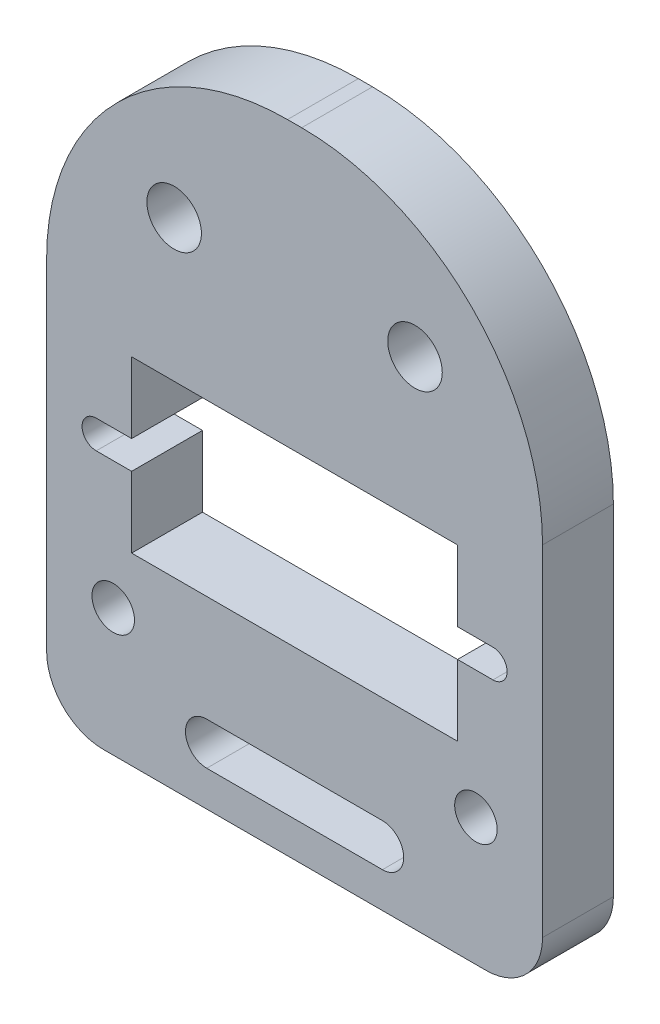
ISO-10303-21;
HEADER;
FILE_DESCRIPTION(('STEP AP214'),'2;1');
FILE_NAME('part.step','',(''),(''),'','','');
FILE_SCHEMA(('AUTOMOTIVE_DESIGN { 1 0 10303 214 1 1 1 1 }'));
ENDSEC;
DATA;
#1=APPLICATION_CONTEXT('core data for automotive mechanical design processes');
#2=APPLICATION_PROTOCOL_DEFINITION('international standard','automotive_design',2000,#1);
#3=PRODUCT_CONTEXT('',#1,'mechanical');
#4=PRODUCT('Part','Part','',(#3));
#5=PRODUCT_RELATED_PRODUCT_CATEGORY('part','',(#4));
#6=PRODUCT_DEFINITION_FORMATION('','',#4);
#7=PRODUCT_DEFINITION_CONTEXT('part definition',#1,'design');
#8=PRODUCT_DEFINITION('design','',#6,#7);
#9=PRODUCT_DEFINITION_SHAPE('','',#8);
#10=(LENGTH_UNIT() NAMED_UNIT(*) SI_UNIT(.MILLI.,.METRE.));
#11=(NAMED_UNIT(*) PLANE_ANGLE_UNIT() SI_UNIT($,.RADIAN.));
#12=(NAMED_UNIT(*) SI_UNIT($,.STERADIAN.) SOLID_ANGLE_UNIT());
#13=UNCERTAINTY_MEASURE_WITH_UNIT(LENGTH_MEASURE(1.E-05),#10,'distance_accuracy_value','');
#14=(GEOMETRIC_REPRESENTATION_CONTEXT(3) GLOBAL_UNCERTAINTY_ASSIGNED_CONTEXT((#13)) GLOBAL_UNIT_ASSIGNED_CONTEXT((#10,
#11,#12)) REPRESENTATION_CONTEXT('',''));
#15=CARTESIAN_POINT('',(0.,0.,0.));
#16=DIRECTION('',(0.,0.,1.));
#17=DIRECTION('',(1.,0.,0.));
#18=AXIS2_PLACEMENT_3D('',#15,#16,#17);
#19=CARTESIAN_POINT('',(-0.5,5.49999999999995,5.));
#20=DIRECTION('',(0.,0.,1.));
#21=DIRECTION('',(1.,0.,0.));
#22=AXIS2_PLACEMENT_3D('',#19,#20,#21);
#23=PLANE('',#22);
#24=CARTESIAN_POINT('',(-12.7999999999999,-13.5000000000001,5.));
#25=DIRECTION('',(0.,0.,1.));
#26=DIRECTION('',(1.,0.,0.));
#27=AXIS2_PLACEMENT_3D('',#24,#25,#26);
#28=CIRCLE('',#27,1.5);
#29=CARTESIAN_POINT('',(-11.2999999999999,-13.5000000000001,5.));
#30=VERTEX_POINT('',#29);
#31=EDGE_CURVE('E292',#30,#30,#28,.T.);
#32=ORIENTED_EDGE('',*,*,#31,.F.);
#33=EDGE_LOOP('',(#32));
#34=FACE_BOUND('',#33,.T.);
#35=CARTESIAN_POINT('',(8.5,12.5,5.));
#36=DIRECTION('',(0.,0.,1.));
#37=DIRECTION('',(1.,0.,0.));
#38=AXIS2_PLACEMENT_3D('',#35,#36,#37);
#39=CIRCLE('',#38,1.92500000000001);
#40=CARTESIAN_POINT('',(10.425,12.5,5.));
#41=VERTEX_POINT('',#40);
#42=EDGE_CURVE('E304',#41,#41,#39,.T.);
#43=ORIENTED_EDGE('',*,*,#42,.F.);
#44=EDGE_LOOP('',(#43));
#45=FACE_BOUND('',#44,.T.);
#46=CARTESIAN_POINT('',(-0.5,5.49999999999995,5.));
#47=DIRECTION('',(0.,0.,1.));
#48=DIRECTION('',(1.,0.,0.));
#49=AXIS2_PLACEMENT_3D('',#46,#47,#48);
#50=CIRCLE('',#49,17.);
#51=CARTESIAN_POINT('',(-0.5,22.5,5.));
#52=VERTEX_POINT('',#51);
#53=CARTESIAN_POINT('',(-17.5,5.49999999999995,5.));
#54=VERTEX_POINT('',#53);
#55=EDGE_CURVE('E340',#52,#54,#50,.T.);
#56=ORIENTED_EDGE('',*,*,#55,.T.);
#57=DIRECTION('',(0.,-1.,0.));
#58=VECTOR('',#57,1.);
#59=CARTESIAN_POINT('',(-17.5,-18.5000000000001,5.));
#60=LINE('',#59,#58);
#61=CARTESIAN_POINT('',(-17.5,-18.5000000000001,5.));
#62=VERTEX_POINT('',#61);
#63=EDGE_CURVE('E343',#54,#62,#60,.T.);
#64=ORIENTED_EDGE('',*,*,#63,.T.);
#65=CARTESIAN_POINT('',(-13.5,-18.5000000000001,5.));
#66=DIRECTION('',(0.,0.,1.));
#67=DIRECTION('',(1.,0.,0.));
#68=AXIS2_PLACEMENT_3D('',#65,#66,#67);
#69=CIRCLE('',#68,4.);
#70=CARTESIAN_POINT('',(-13.5,-22.5000000000001,5.));
#71=VERTEX_POINT('',#70);
#72=EDGE_CURVE('E346',#62,#71,#69,.T.);
#73=ORIENTED_EDGE('',*,*,#72,.T.);
#74=DIRECTION('',(1.,0.,0.));
#75=VECTOR('',#74,1.);
#76=CARTESIAN_POINT('',(13.5,-22.5000000000001,5.));
#77=LINE('',#76,#75);
#78=CARTESIAN_POINT('',(13.5,-22.5000000000001,5.));
#79=VERTEX_POINT('',#78);
#80=EDGE_CURVE('E348',#71,#79,#77,.T.);
#81=ORIENTED_EDGE('',*,*,#80,.T.);
#82=CARTESIAN_POINT('',(13.5,-18.5000000000001,5.));
#83=DIRECTION('',(0.,0.,1.));
#84=DIRECTION('',(1.,0.,0.));
#85=AXIS2_PLACEMENT_3D('',#82,#83,#84);
#86=CIRCLE('',#85,4.00000000000004);
#87=CARTESIAN_POINT('',(17.5000000000001,-18.5000000000001,5.));
#88=VERTEX_POINT('',#87);
#89=EDGE_CURVE('E350',#79,#88,#86,.T.);
#90=ORIENTED_EDGE('',*,*,#89,.T.);
#91=DIRECTION('',(0.,1.,0.));
#92=VECTOR('',#91,1.);
#93=CARTESIAN_POINT('',(17.5,5.5,5.));
#94=LINE('',#93,#92);
#95=CARTESIAN_POINT('',(17.5,5.5,5.));
#96=VERTEX_POINT('',#95);
#97=EDGE_CURVE('E352',#88,#96,#94,.T.);
#98=ORIENTED_EDGE('',*,*,#97,.T.);
#99=CARTESIAN_POINT('',(0.5,5.49999999999995,5.));
#100=DIRECTION('',(0.,0.,1.));
#101=DIRECTION('',(1.,0.,0.));
#102=AXIS2_PLACEMENT_3D('',#99,#100,#101);
#103=CIRCLE('',#102,17.);
#104=CARTESIAN_POINT('',(0.5,22.5,5.));
#105=VERTEX_POINT('',#104);
#106=EDGE_CURVE('E354',#96,#105,#103,.T.);
#107=ORIENTED_EDGE('',*,*,#106,.T.);
#108=DIRECTION('',(-1.,0.,0.));
#109=VECTOR('',#108,1.);
#110=CARTESIAN_POINT('',(-0.5,22.5,5.));
#111=LINE('',#110,#109);
#112=EDGE_CURVE('E356',#105,#52,#111,.T.);
#113=ORIENTED_EDGE('',*,*,#112,.T.);
#114=EDGE_LOOP('',(#56,#64,#73,#81,#90,#98,#107,#113));
#115=FACE_BOUND('',#114,.T.);
#116=DIRECTION('',(1.,0.,0.));
#117=VECTOR('',#116,1.);
#118=CARTESIAN_POINT('',(-6.2,-20.0000000000001,5.));
#119=LINE('',#118,#117);
#120=CARTESIAN_POINT('',(-6.2,-20.0000000000001,5.));
#121=VERTEX_POINT('',#120);
#122=CARTESIAN_POINT('',(6.2,-20.0000000000001,5.));
#123=VERTEX_POINT('',#122);
#124=EDGE_CURVE('E312',#121,#123,#119,.T.);
#125=ORIENTED_EDGE('',*,*,#124,.F.);
#126=CARTESIAN_POINT('',(-6.2,-18.5000000000001,5.));
#127=DIRECTION('',(0.,0.,1.));
#128=DIRECTION('',(1.,0.,0.));
#129=AXIS2_PLACEMENT_3D('',#126,#127,#128);
#130=CIRCLE('',#129,1.5);
#131=CARTESIAN_POINT('',(-6.2,-17.0000000000001,5.));
#132=VERTEX_POINT('',#131);
#133=EDGE_CURVE('E310',#132,#121,#130,.T.);
#134=ORIENTED_EDGE('',*,*,#133,.F.);
#135=DIRECTION('',(-1.,0.,0.));
#136=VECTOR('',#135,1.);
#137=CARTESIAN_POINT('',(6.2,-17.0000000000001,5.));
#138=LINE('',#137,#136);
#139=CARTESIAN_POINT('',(6.2,-17.0000000000001,5.));
#140=VERTEX_POINT('',#139);
#141=EDGE_CURVE('E318',#140,#132,#138,.T.);
#142=ORIENTED_EDGE('',*,*,#141,.F.);
#143=CARTESIAN_POINT('',(6.2,-18.5000000000001,5.));
#144=DIRECTION('',(0.,0.,1.));
#145=DIRECTION('',(1.,0.,0.));
#146=AXIS2_PLACEMENT_3D('',#143,#144,#145);
#147=CIRCLE('',#146,1.5);
#148=EDGE_CURVE('E315',#123,#140,#147,.T.);
#149=ORIENTED_EDGE('',*,*,#148,.F.);
#150=EDGE_LOOP('',(#125,#134,#142,#149));
#151=FACE_BOUND('',#150,.T.);
#152=CARTESIAN_POINT('',(-8.5,12.5,5.));
#153=DIRECTION('',(0.,0.,1.));
#154=DIRECTION('',(1.,0.,0.));
#155=AXIS2_PLACEMENT_3D('',#152,#153,#154);
#156=CIRCLE('',#155,1.92500000000001);
#157=CARTESIAN_POINT('',(-6.57499999999999,12.5,5.));
#158=VERTEX_POINT('',#157);
#159=EDGE_CURVE('E298',#158,#158,#156,.T.);
#160=ORIENTED_EDGE('',*,*,#159,.F.);
#161=EDGE_LOOP('',(#160));
#162=FACE_BOUND('',#161,.T.);
#163=CARTESIAN_POINT('',(12.8,-13.5000000000001,5.));
#164=DIRECTION('',(0.,0.,1.));
#165=DIRECTION('',(1.,0.,0.));
#166=AXIS2_PLACEMENT_3D('',#163,#164,#165);
#167=CIRCLE('',#166,1.5);
#168=CARTESIAN_POINT('',(14.3,-13.5000000000001,5.));
#169=VERTEX_POINT('',#168);
#170=EDGE_CURVE('E286',#169,#169,#167,.T.);
#171=ORIENTED_EDGE('',*,*,#170,.F.);
#172=EDGE_LOOP('',(#171));
#173=FACE_BOUND('',#172,.T.);
#174=DIRECTION('',(-1.,0.,0.));
#175=VECTOR('',#174,1.);
#176=CARTESIAN_POINT('',(14.,-2.49999999999916,5.));
#177=LINE('',#176,#175);
#178=CARTESIAN_POINT('',(14.,-2.49999999999916,5.));
#179=VERTEX_POINT('',#178);
#180=CARTESIAN_POINT('',(11.5,-2.49999999999917,5.));
#181=VERTEX_POINT('',#180);
#182=EDGE_CURVE('E201',#179,#181,#177,.T.);
#183=ORIENTED_EDGE('',*,*,#182,.F.);
#184=CARTESIAN_POINT('',(14.,-3.49999999999917,5.));
#185=DIRECTION('',(0.,0.,1.));
#186=DIRECTION('',(1.,0.,0.));
#187=AXIS2_PLACEMENT_3D('',#184,#185,#186);
#188=CIRCLE('',#187,1.);
#189=CARTESIAN_POINT('',(14.0000000000002,-4.49999999999917,5.));
#190=VERTEX_POINT('',#189);
#191=EDGE_CURVE('E193',#190,#179,#188,.T.);
#192=ORIENTED_EDGE('',*,*,#191,.F.);
#193=DIRECTION('',(1.,0.,0.));
#194=VECTOR('',#193,1.);
#195=CARTESIAN_POINT('',(11.5,-4.49999999999917,5.));
#196=LINE('',#195,#194);
#197=CARTESIAN_POINT('',(11.5,-4.49999999999917,5.));
#198=VERTEX_POINT('',#197);
#199=EDGE_CURVE('E234',#198,#190,#196,.T.);
#200=ORIENTED_EDGE('',*,*,#199,.F.);
#201=DIRECTION('',(0.,1.,0.));
#202=VECTOR('',#201,1.);
#203=CARTESIAN_POINT('',(11.5,-9.49999999999895,5.));
#204=LINE('',#203,#202);
#205=CARTESIAN_POINT('',(11.5,-9.49999999999895,5.));
#206=VERTEX_POINT('',#205);
#207=EDGE_CURVE('E232',#206,#198,#204,.T.);
#208=ORIENTED_EDGE('',*,*,#207,.F.);
#209=DIRECTION('',(1.,0.,0.));
#210=VECTOR('',#209,1.);
#211=CARTESIAN_POINT('',(-11.5,-9.49999999999895,5.));
#212=LINE('',#211,#210);
#213=CARTESIAN_POINT('',(-11.5,-9.49999999999895,5.));
#214=VERTEX_POINT('',#213);
#215=EDGE_CURVE('E230',#214,#206,#212,.T.);
#216=ORIENTED_EDGE('',*,*,#215,.F.);
#217=DIRECTION('',(0.,-1.,0.));
#218=VECTOR('',#217,1.);
#219=CARTESIAN_POINT('',(-11.5,-4.50000000000017,5.));
#220=LINE('',#219,#218);
#221=CARTESIAN_POINT('',(-11.5,-4.50000000000017,5.));
#222=VERTEX_POINT('',#221);
#223=EDGE_CURVE('E228',#222,#214,#220,.T.);
#224=ORIENTED_EDGE('',*,*,#223,.F.);
#225=DIRECTION('',(1.,0.,0.));
#226=VECTOR('',#225,1.);
#227=CARTESIAN_POINT('',(-14.,-4.50000000000017,5.));
#228=LINE('',#227,#226);
#229=CARTESIAN_POINT('',(-14.,-4.50000000000017,5.));
#230=VERTEX_POINT('',#229);
#231=EDGE_CURVE('E226',#230,#222,#228,.T.);
#232=ORIENTED_EDGE('',*,*,#231,.F.);
#233=CARTESIAN_POINT('',(-14.,-3.50000000000017,5.));
#234=DIRECTION('',(0.,0.,1.));
#235=DIRECTION('',(1.,0.,0.));
#236=AXIS2_PLACEMENT_3D('',#233,#234,#235);
#237=CIRCLE('',#236,1.);
#238=CARTESIAN_POINT('',(-14.,-2.50000000000017,5.));
#239=VERTEX_POINT('',#238);
#240=EDGE_CURVE('E224',#239,#230,#237,.T.);
#241=ORIENTED_EDGE('',*,*,#240,.F.);
#242=DIRECTION('',(-1.,0.,0.));
#243=VECTOR('',#242,1.);
#244=CARTESIAN_POINT('',(-11.5,-2.50000000000017,5.));
#245=LINE('',#244,#243);
#246=CARTESIAN_POINT('',(-11.5,-2.50000000000017,5.));
#247=VERTEX_POINT('',#246);
#248=EDGE_CURVE('E222',#247,#239,#245,.T.);
#249=ORIENTED_EDGE('',*,*,#248,.F.);
#250=DIRECTION('',(0.,-1.,0.));
#251=VECTOR('',#250,1.);
#252=CARTESIAN_POINT('',(-11.5,2.50000000000072,5.));
#253=LINE('',#252,#251);
#254=CARTESIAN_POINT('',(-11.5,2.50000000000072,5.));
#255=VERTEX_POINT('',#254);
#256=EDGE_CURVE('E220',#255,#247,#253,.T.);
#257=ORIENTED_EDGE('',*,*,#256,.F.);
#258=DIRECTION('',(-1.,0.,0.));
#259=VECTOR('',#258,1.);
#260=CARTESIAN_POINT('',(11.5,2.50000000000073,5.));
#261=LINE('',#260,#259);
#262=CARTESIAN_POINT('',(11.5,2.50000000000073,5.));
#263=VERTEX_POINT('',#262);
#264=EDGE_CURVE('E216',#263,#255,#261,.T.);
#265=ORIENTED_EDGE('',*,*,#264,.F.);
#266=DIRECTION('',(0.,1.,0.));
#267=VECTOR('',#266,1.);
#268=CARTESIAN_POINT('',(11.5,-2.49999999999917,5.));
#269=LINE('',#268,#267);
#270=EDGE_CURVE('E214',#181,#263,#269,.T.);
#271=ORIENTED_EDGE('',*,*,#270,.F.);
#272=EDGE_LOOP('',(#183,#192,#200,#208,#216,#224,#232,#241,#249,#257,#265,#271));
#273=FACE_BOUND('',#272,.T.);
#274=ADVANCED_FACE('F32',(#34,#45,#115,#151,#162,#173,#273),#23,.T.);
#275=CARTESIAN_POINT('',(-0.5,5.49999999999995,0.));
#276=DIRECTION('',(0.,0.,1.));
#277=DIRECTION('',(1.,0.,0.));
#278=AXIS2_PLACEMENT_3D('',#275,#276,#277);
#279=PLANE('',#278);
#280=CARTESIAN_POINT('',(12.8,-13.5000000000001,0.));
#281=DIRECTION('',(0.,0.,1.));
#282=DIRECTION('',(1.,0.,0.));
#283=AXIS2_PLACEMENT_3D('',#280,#281,#282);
#284=CIRCLE('',#283,1.5);
#285=CARTESIAN_POINT('',(14.3,-13.5000000000001,0.));
#286=VERTEX_POINT('',#285);
#287=EDGE_CURVE('E209',#286,#286,#284,.T.);
#288=ORIENTED_EDGE('',*,*,#287,.T.);
#289=EDGE_LOOP('',(#288));
#290=FACE_BOUND('',#289,.T.);
#291=CARTESIAN_POINT('',(-12.7999999999999,-13.5000000000001,0.));
#292=DIRECTION('',(0.,0.,1.));
#293=DIRECTION('',(1.,0.,0.));
#294=AXIS2_PLACEMENT_3D('',#291,#292,#293);
#295=CIRCLE('',#294,1.5);
#296=CARTESIAN_POINT('',(-11.2999999999999,-13.5000000000001,0.));
#297=VERTEX_POINT('',#296);
#298=EDGE_CURVE('E289',#297,#297,#295,.T.);
#299=ORIENTED_EDGE('',*,*,#298,.T.);
#300=EDGE_LOOP('',(#299));
#301=FACE_BOUND('',#300,.T.);
#302=CARTESIAN_POINT('',(-8.5,12.5,0.));
#303=DIRECTION('',(0.,0.,1.));
#304=DIRECTION('',(1.,0.,0.));
#305=AXIS2_PLACEMENT_3D('',#302,#303,#304);
#306=CIRCLE('',#305,1.92500000000001);
#307=CARTESIAN_POINT('',(-6.57499999999999,12.5,0.));
#308=VERTEX_POINT('',#307);
#309=EDGE_CURVE('E295',#308,#308,#306,.T.);
#310=ORIENTED_EDGE('',*,*,#309,.T.);
#311=EDGE_LOOP('',(#310));
#312=FACE_BOUND('',#311,.T.);
#313=CARTESIAN_POINT('',(8.5,12.5,0.));
#314=DIRECTION('',(0.,0.,1.));
#315=DIRECTION('',(1.,0.,0.));
#316=AXIS2_PLACEMENT_3D('',#313,#314,#315);
#317=CIRCLE('',#316,1.92500000000001);
#318=CARTESIAN_POINT('',(10.425,12.5,0.));
#319=VERTEX_POINT('',#318);
#320=EDGE_CURVE('E301',#319,#319,#317,.T.);
#321=ORIENTED_EDGE('',*,*,#320,.T.);
#322=EDGE_LOOP('',(#321));
#323=FACE_BOUND('',#322,.T.);
#324=CARTESIAN_POINT('',(-6.2,-18.5000000000001,0.));
#325=DIRECTION('',(0.,0.,1.));
#326=DIRECTION('',(1.,0.,0.));
#327=AXIS2_PLACEMENT_3D('',#324,#325,#326);
#328=CIRCLE('',#327,1.5);
#329=CARTESIAN_POINT('',(-6.2,-17.0000000000001,0.));
#330=VERTEX_POINT('',#329);
#331=CARTESIAN_POINT('',(-6.2,-20.0000000000001,0.));
#332=VERTEX_POINT('',#331);
#333=EDGE_CURVE('E307',#330,#332,#328,.T.);
#334=ORIENTED_EDGE('',*,*,#333,.T.);
#335=DIRECTION('',(1.,0.,0.));
#336=VECTOR('',#335,1.);
#337=CARTESIAN_POINT('',(-6.2,-20.0000000000001,0.));
#338=LINE('',#337,#336);
#339=CARTESIAN_POINT('',(6.2,-20.0000000000001,0.));
#340=VERTEX_POINT('',#339);
#341=EDGE_CURVE('E323',#332,#340,#338,.T.);
#342=ORIENTED_EDGE('',*,*,#341,.T.);
#343=CARTESIAN_POINT('',(6.2,-18.5000000000001,0.));
#344=DIRECTION('',(0.,0.,1.));
#345=DIRECTION('',(1.,0.,0.));
#346=AXIS2_PLACEMENT_3D('',#343,#344,#345);
#347=CIRCLE('',#346,1.5);
#348=CARTESIAN_POINT('',(6.2,-17.0000000000001,0.));
#349=VERTEX_POINT('',#348);
#350=EDGE_CURVE('E326',#340,#349,#347,.T.);
#351=ORIENTED_EDGE('',*,*,#350,.T.);
#352=DIRECTION('',(-1.,0.,0.));
#353=VECTOR('',#352,1.);
#354=CARTESIAN_POINT('',(6.2,-17.0000000000001,0.));
#355=LINE('',#354,#353);
#356=EDGE_CURVE('E313',#349,#330,#355,.T.);
#357=ORIENTED_EDGE('',*,*,#356,.T.);
#358=EDGE_LOOP('',(#334,#342,#351,#357));
#359=FACE_BOUND('',#358,.T.);
#360=CARTESIAN_POINT('',(-0.5,5.49999999999995,0.));
#361=DIRECTION('',(0.,0.,1.));
#362=DIRECTION('',(1.,0.,0.));
#363=AXIS2_PLACEMENT_3D('',#360,#361,#362);
#364=CIRCLE('',#363,17.);
#365=CARTESIAN_POINT('',(-0.5,22.5,0.));
#366=VERTEX_POINT('',#365);
#367=CARTESIAN_POINT('',(-17.5,5.49999999999995,0.));
#368=VERTEX_POINT('',#367);
#369=EDGE_CURVE('E339',#366,#368,#364,.T.);
#370=ORIENTED_EDGE('',*,*,#369,.F.);
#371=DIRECTION('',(-1.,0.,0.));
#372=VECTOR('',#371,1.);
#373=CARTESIAN_POINT('',(-0.5,22.5,0.));
#374=LINE('',#373,#372);
#375=CARTESIAN_POINT('',(0.5,22.5,0.));
#376=VERTEX_POINT('',#375);
#377=EDGE_CURVE('E344',#376,#366,#374,.T.);
#378=ORIENTED_EDGE('',*,*,#377,.F.);
#379=CARTESIAN_POINT('',(0.5,5.49999999999995,0.));
#380=DIRECTION('',(0.,0.,1.));
#381=DIRECTION('',(1.,0.,0.));
#382=AXIS2_PLACEMENT_3D('',#379,#380,#381);
#383=CIRCLE('',#382,17.);
#384=CARTESIAN_POINT('',(17.5,5.5,0.));
#385=VERTEX_POINT('',#384);
#386=EDGE_CURVE('E371',#385,#376,#383,.T.);
#387=ORIENTED_EDGE('',*,*,#386,.F.);
#388=DIRECTION('',(0.,1.,0.));
#389=VECTOR('',#388,1.);
#390=CARTESIAN_POINT('',(17.5,5.5,0.));
#391=LINE('',#390,#389);
#392=CARTESIAN_POINT('',(17.5000000000001,-18.5000000000001,0.));
#393=VERTEX_POINT('',#392);
#394=EDGE_CURVE('E369',#393,#385,#391,.T.);
#395=ORIENTED_EDGE('',*,*,#394,.F.);
#396=CARTESIAN_POINT('',(13.5,-18.5000000000001,0.));
#397=DIRECTION('',(0.,0.,1.));
#398=DIRECTION('',(1.,0.,0.));
#399=AXIS2_PLACEMENT_3D('',#396,#397,#398);
#400=CIRCLE('',#399,4.00000000000004);
#401=CARTESIAN_POINT('',(13.5,-22.5000000000001,0.));
#402=VERTEX_POINT('',#401);
#403=EDGE_CURVE('E367',#402,#393,#400,.T.);
#404=ORIENTED_EDGE('',*,*,#403,.F.);
#405=DIRECTION('',(1.,0.,0.));
#406=VECTOR('',#405,1.);
#407=CARTESIAN_POINT('',(13.5,-22.5000000000001,0.));
#408=LINE('',#407,#406);
#409=CARTESIAN_POINT('',(-13.5,-22.5000000000001,0.));
#410=VERTEX_POINT('',#409);
#411=EDGE_CURVE('E365',#410,#402,#408,.T.);
#412=ORIENTED_EDGE('',*,*,#411,.F.);
#413=CARTESIAN_POINT('',(-13.5,-18.5000000000001,0.));
#414=DIRECTION('',(0.,0.,1.));
#415=DIRECTION('',(1.,0.,0.));
#416=AXIS2_PLACEMENT_3D('',#413,#414,#415);
#417=CIRCLE('',#416,4.);
#418=CARTESIAN_POINT('',(-17.5,-18.5000000000001,0.));
#419=VERTEX_POINT('',#418);
#420=EDGE_CURVE('E363',#419,#410,#417,.T.);
#421=ORIENTED_EDGE('',*,*,#420,.F.);
#422=DIRECTION('',(0.,-1.,0.));
#423=VECTOR('',#422,1.);
#424=CARTESIAN_POINT('',(-17.5,-18.5000000000001,0.));
#425=LINE('',#424,#423);
#426=EDGE_CURVE('E361',#368,#419,#425,.T.);
#427=ORIENTED_EDGE('',*,*,#426,.F.);
#428=EDGE_LOOP('',(#370,#378,#387,#395,#404,#412,#421,#427));
#429=FACE_BOUND('',#428,.T.);
#430=CARTESIAN_POINT('',(14.,-3.49999999999917,0.));
#431=DIRECTION('',(0.,0.,1.));
#432=DIRECTION('',(1.,0.,0.));
#433=AXIS2_PLACEMENT_3D('',#430,#431,#432);
#434=CIRCLE('',#433,1.);
#435=CARTESIAN_POINT('',(14.0000000000002,-4.49999999999917,0.));
#436=VERTEX_POINT('',#435);
#437=CARTESIAN_POINT('',(14.,-2.49999999999916,0.));
#438=VERTEX_POINT('',#437);
#439=EDGE_CURVE('E55',#436,#438,#434,.T.);
#440=ORIENTED_EDGE('',*,*,#439,.T.);
#441=DIRECTION('',(-1.,0.,0.));
#442=VECTOR('',#441,1.);
#443=CARTESIAN_POINT('',(14.,-2.49999999999916,0.));
#444=LINE('',#443,#442);
#445=CARTESIAN_POINT('',(11.5,-2.49999999999917,0.));
#446=VERTEX_POINT('',#445);
#447=EDGE_CURVE('E208',#438,#446,#444,.T.);
#448=ORIENTED_EDGE('',*,*,#447,.T.);
#449=DIRECTION('',(0.,1.,0.));
#450=VECTOR('',#449,1.);
#451=CARTESIAN_POINT('',(11.5,-2.49999999999917,0.));
#452=LINE('',#451,#450);
#453=CARTESIAN_POINT('',(11.5,2.50000000000073,0.));
#454=VERTEX_POINT('',#453);
#455=EDGE_CURVE('E238',#446,#454,#452,.T.);
#456=ORIENTED_EDGE('',*,*,#455,.T.);
#457=DIRECTION('',(-1.,0.,0.));
#458=VECTOR('',#457,1.);
#459=CARTESIAN_POINT('',(11.5,2.50000000000073,0.));
#460=LINE('',#459,#458);
#461=CARTESIAN_POINT('',(-11.5,2.50000000000072,0.));
#462=VERTEX_POINT('',#461);
#463=EDGE_CURVE('E241',#454,#462,#460,.T.);
#464=ORIENTED_EDGE('',*,*,#463,.T.);
#465=DIRECTION('',(0.,-1.,0.));
#466=VECTOR('',#465,1.);
#467=CARTESIAN_POINT('',(-11.5,2.50000000000072,0.));
#468=LINE('',#467,#466);
#469=CARTESIAN_POINT('',(-11.5,-2.50000000000017,0.));
#470=VERTEX_POINT('',#469);
#471=EDGE_CURVE('E244',#462,#470,#468,.T.);
#472=ORIENTED_EDGE('',*,*,#471,.T.);
#473=DIRECTION('',(-1.,0.,0.));
#474=VECTOR('',#473,1.);
#475=CARTESIAN_POINT('',(-11.5,-2.50000000000017,0.));
#476=LINE('',#475,#474);
#477=CARTESIAN_POINT('',(-14.,-2.50000000000017,0.));
#478=VERTEX_POINT('',#477);
#479=EDGE_CURVE('E247',#470,#478,#476,.T.);
#480=ORIENTED_EDGE('',*,*,#479,.T.);
#481=CARTESIAN_POINT('',(-14.,-3.50000000000017,0.));
#482=DIRECTION('',(0.,0.,1.));
#483=DIRECTION('',(1.,0.,0.));
#484=AXIS2_PLACEMENT_3D('',#481,#482,#483);
#485=CIRCLE('',#484,1.);
#486=CARTESIAN_POINT('',(-14.,-4.50000000000017,0.));
#487=VERTEX_POINT('',#486);
#488=EDGE_CURVE('E250',#478,#487,#485,.T.);
#489=ORIENTED_EDGE('',*,*,#488,.T.);
#490=DIRECTION('',(1.,0.,0.));
#491=VECTOR('',#490,1.);
#492=CARTESIAN_POINT('',(-14.,-4.50000000000017,0.));
#493=LINE('',#492,#491);
#494=CARTESIAN_POINT('',(-11.5,-4.50000000000017,0.));
#495=VERTEX_POINT('',#494);
#496=EDGE_CURVE('E253',#487,#495,#493,.T.);
#497=ORIENTED_EDGE('',*,*,#496,.T.);
#498=DIRECTION('',(0.,-1.,0.));
#499=VECTOR('',#498,1.);
#500=CARTESIAN_POINT('',(-11.5,-4.50000000000017,0.));
#501=LINE('',#500,#499);
#502=CARTESIAN_POINT('',(-11.5,-9.49999999999895,0.));
#503=VERTEX_POINT('',#502);
#504=EDGE_CURVE('E256',#495,#503,#501,.T.);
#505=ORIENTED_EDGE('',*,*,#504,.T.);
#506=DIRECTION('',(1.,0.,0.));
#507=VECTOR('',#506,1.);
#508=CARTESIAN_POINT('',(-11.5,-9.49999999999895,0.));
#509=LINE('',#508,#507);
#510=CARTESIAN_POINT('',(11.5,-9.49999999999895,0.));
#511=VERTEX_POINT('',#510);
#512=EDGE_CURVE('E259',#503,#511,#509,.T.);
#513=ORIENTED_EDGE('',*,*,#512,.T.);
#514=DIRECTION('',(0.,1.,0.));
#515=VECTOR('',#514,1.);
#516=CARTESIAN_POINT('',(11.5,-9.49999999999895,0.));
#517=LINE('',#516,#515);
#518=CARTESIAN_POINT('',(11.5,-4.49999999999917,0.));
#519=VERTEX_POINT('',#518);
#520=EDGE_CURVE('E262',#511,#519,#517,.T.);
#521=ORIENTED_EDGE('',*,*,#520,.T.);
#522=DIRECTION('',(1.,0.,0.));
#523=VECTOR('',#522,1.);
#524=CARTESIAN_POINT('',(11.5,-4.49999999999917,0.));
#525=LINE('',#524,#523);
#526=EDGE_CURVE('E202',#519,#436,#525,.T.);
#527=ORIENTED_EDGE('',*,*,#526,.T.);
#528=EDGE_LOOP('',(#440,#448,#456,#464,#472,#480,#489,#497,#505,#513,#521,#527));
#529=FACE_BOUND('',#528,.T.);
#530=ADVANCED_FACE('F401',(#290,#301,#312,#323,#359,#429,#529),#279,.F.);
#531=CARTESIAN_POINT('',(-0.5,5.49999999999995,5.));
#532=DIRECTION('',(0.,0.,-1.));
#533=DIRECTION('',(-1.,0.,0.));
#534=AXIS2_PLACEMENT_3D('',#531,#532,#533);
#535=CYLINDRICAL_SURFACE('',#534,17.);
#536=ORIENTED_EDGE('',*,*,#369,.T.);
#537=DIRECTION('',(0.,0.,-1.));
#538=VECTOR('',#537,1.);
#539=CARTESIAN_POINT('',(-17.5,5.49999999999995,5.));
#540=LINE('',#539,#538);
#541=EDGE_CURVE('E11',#54,#368,#540,.T.);
#542=ORIENTED_EDGE('',*,*,#541,.F.);
#543=ORIENTED_EDGE('',*,*,#55,.F.);
#544=DIRECTION('',(0.,0.,-1.));
#545=VECTOR('',#544,1.);
#546=CARTESIAN_POINT('',(-0.5,22.5,5.));
#547=LINE('',#546,#545);
#548=EDGE_CURVE('E358',#52,#366,#547,.T.);
#549=ORIENTED_EDGE('',*,*,#548,.T.);
#550=EDGE_LOOP('',(#536,#542,#543,#549));
#551=FACE_BOUND('',#550,.T.);
#552=ADVANCED_FACE('F34',(#551),#535,.T.);
#553=CARTESIAN_POINT('',(-17.5,-18.5000000000001,5.));
#554=DIRECTION('',(1.,0.,0.));
#555=DIRECTION('',(0.,0.,-1.));
#556=AXIS2_PLACEMENT_3D('',#553,#554,#555);
#557=PLANE('',#556);
#558=ORIENTED_EDGE('',*,*,#426,.T.);
#559=DIRECTION('',(0.,0.,-1.));
#560=VECTOR('',#559,1.);
#561=CARTESIAN_POINT('',(-17.5,-18.5000000000001,5.));
#562=LINE('',#561,#560);
#563=EDGE_CURVE('E40',#62,#419,#562,.T.);
#564=ORIENTED_EDGE('',*,*,#563,.F.);
#565=ORIENTED_EDGE('',*,*,#63,.F.);
#566=ORIENTED_EDGE('',*,*,#541,.T.);
#567=EDGE_LOOP('',(#558,#564,#565,#566));
#568=FACE_BOUND('',#567,.T.);
#569=ADVANCED_FACE('F419',(#568),#557,.F.);
#570=CARTESIAN_POINT('',(-13.5,-18.5000000000001,5.));
#571=DIRECTION('',(0.,0.,-1.));
#572=DIRECTION('',(-1.,0.,0.));
#573=AXIS2_PLACEMENT_3D('',#570,#571,#572);
#574=CYLINDRICAL_SURFACE('',#573,4.);
#575=ORIENTED_EDGE('',*,*,#420,.T.);
#576=DIRECTION('',(0.,0.,-1.));
#577=VECTOR('',#576,1.);
#578=CARTESIAN_POINT('',(-13.5,-22.5000000000001,5.));
#579=LINE('',#578,#577);
#580=EDGE_CURVE('E388',#71,#410,#579,.T.);
#581=ORIENTED_EDGE('',*,*,#580,.F.);
#582=ORIENTED_EDGE('',*,*,#72,.F.);
#583=ORIENTED_EDGE('',*,*,#563,.T.);
#584=EDGE_LOOP('',(#575,#581,#582,#583));
#585=FACE_BOUND('',#584,.T.);
#586=ADVANCED_FACE('F395',(#585),#574,.T.);
#587=CARTESIAN_POINT('',(13.5,-22.5000000000001,5.));
#588=DIRECTION('',(0.,1.,0.));
#589=DIRECTION('',(0.,0.,1.));
#590=AXIS2_PLACEMENT_3D('',#587,#588,#589);
#591=PLANE('',#590);
#592=ORIENTED_EDGE('',*,*,#411,.T.);
#593=DIRECTION('',(0.,0.,-1.));
#594=VECTOR('',#593,1.);
#595=CARTESIAN_POINT('',(13.5,-22.5000000000001,5.));
#596=LINE('',#595,#594);
#597=EDGE_CURVE('E385',#79,#402,#596,.T.);
#598=ORIENTED_EDGE('',*,*,#597,.F.);
#599=ORIENTED_EDGE('',*,*,#80,.F.);
#600=ORIENTED_EDGE('',*,*,#580,.T.);
#601=EDGE_LOOP('',(#592,#598,#599,#600));
#602=FACE_BOUND('',#601,.T.);
#603=ADVANCED_FACE('F407',(#602),#591,.F.);
#604=CARTESIAN_POINT('',(13.5,-18.5000000000001,5.));
#605=DIRECTION('',(0.,0.,-1.));
#606=DIRECTION('',(-1.,0.,0.));
#607=AXIS2_PLACEMENT_3D('',#604,#605,#606);
#608=CYLINDRICAL_SURFACE('',#607,4.00000000000004);
#609=ORIENTED_EDGE('',*,*,#403,.T.);
#610=DIRECTION('',(0.,0.,-1.));
#611=VECTOR('',#610,1.);
#612=CARTESIAN_POINT('',(17.5000000000001,-18.5000000000001,5.));
#613=LINE('',#612,#611);
#614=EDGE_CURVE('E382',#88,#393,#613,.T.);
#615=ORIENTED_EDGE('',*,*,#614,.F.);
#616=ORIENTED_EDGE('',*,*,#89,.F.);
#617=ORIENTED_EDGE('',*,*,#597,.T.);
#618=EDGE_LOOP('',(#609,#615,#616,#617));
#619=FACE_BOUND('',#618,.T.);
#620=ADVANCED_FACE('F411',(#619),#608,.T.);
#621=CARTESIAN_POINT('',(17.5,5.5,5.));
#622=DIRECTION('',(-1.,0.,0.));
#623=DIRECTION('',(0.,-1.,0.));
#624=AXIS2_PLACEMENT_3D('',#621,#622,#623);
#625=PLANE('',#624);
#626=ORIENTED_EDGE('',*,*,#394,.T.);
#627=DIRECTION('',(0.,0.,-1.));
#628=VECTOR('',#627,1.);
#629=CARTESIAN_POINT('',(17.5,5.5,5.));
#630=LINE('',#629,#628);
#631=EDGE_CURVE('E379',#96,#385,#630,.T.);
#632=ORIENTED_EDGE('',*,*,#631,.F.);
#633=ORIENTED_EDGE('',*,*,#97,.F.);
#634=ORIENTED_EDGE('',*,*,#614,.T.);
#635=EDGE_LOOP('',(#626,#632,#633,#634));
#636=FACE_BOUND('',#635,.T.);
#637=ADVANCED_FACE('F432',(#636),#625,.F.);
#638=CARTESIAN_POINT('',(0.5,5.49999999999995,5.));
#639=DIRECTION('',(0.,0.,-1.));
#640=DIRECTION('',(-1.,0.,0.));
#641=AXIS2_PLACEMENT_3D('',#638,#639,#640);
#642=CYLINDRICAL_SURFACE('',#641,17.);
#643=ORIENTED_EDGE('',*,*,#386,.T.);
#644=DIRECTION('',(0.,0.,-1.));
#645=VECTOR('',#644,1.);
#646=CARTESIAN_POINT('',(0.5,22.5,5.));
#647=LINE('',#646,#645);
#648=EDGE_CURVE('E376',#105,#376,#647,.T.);
#649=ORIENTED_EDGE('',*,*,#648,.F.);
#650=ORIENTED_EDGE('',*,*,#106,.F.);
#651=ORIENTED_EDGE('',*,*,#631,.T.);
#652=EDGE_LOOP('',(#643,#649,#650,#651));
#653=FACE_BOUND('',#652,.T.);
#654=ADVANCED_FACE('F430',(#653),#642,.T.);
#655=CARTESIAN_POINT('',(-0.5,22.5,5.));
#656=DIRECTION('',(0.,-1.,0.));
#657=DIRECTION('',(0.,0.,-1.));
#658=AXIS2_PLACEMENT_3D('',#655,#656,#657);
#659=PLANE('',#658);
#660=ORIENTED_EDGE('',*,*,#377,.T.);
#661=ORIENTED_EDGE('',*,*,#548,.F.);
#662=ORIENTED_EDGE('',*,*,#112,.F.);
#663=ORIENTED_EDGE('',*,*,#648,.T.);
#664=EDGE_LOOP('',(#660,#661,#662,#663));
#665=FACE_BOUND('',#664,.T.);
#666=ADVANCED_FACE('F425',(#665),#659,.F.);
#667=CARTESIAN_POINT('',(-6.2,-18.5000000000001,5.));
#668=DIRECTION('',(0.,0.,-1.));
#669=DIRECTION('',(-1.,0.,0.));
#670=AXIS2_PLACEMENT_3D('',#667,#668,#669);
#671=CYLINDRICAL_SURFACE('',#670,1.5);
#672=ORIENTED_EDGE('',*,*,#333,.F.);
#673=DIRECTION('',(0.,0.,-1.));
#674=VECTOR('',#673,1.);
#675=CARTESIAN_POINT('',(-6.2,-17.0000000000001,5.));
#676=LINE('',#675,#674);
#677=EDGE_CURVE('E320',#132,#330,#676,.T.);
#678=ORIENTED_EDGE('',*,*,#677,.F.);
#679=ORIENTED_EDGE('',*,*,#133,.T.);
#680=DIRECTION('',(0.,0.,-1.));
#681=VECTOR('',#680,1.);
#682=CARTESIAN_POINT('',(-6.2,-20.0000000000001,5.));
#683=LINE('',#682,#681);
#684=EDGE_CURVE('E337',#121,#332,#683,.T.);
#685=ORIENTED_EDGE('',*,*,#684,.T.);
#686=EDGE_LOOP('',(#672,#678,#679,#685));
#687=FACE_BOUND('',#686,.T.);
#688=ADVANCED_FACE('F452',(#687),#671,.F.);
#689=CARTESIAN_POINT('',(-6.2,-20.0000000000001,5.));
#690=DIRECTION('',(0.,1.,0.));
#691=DIRECTION('',(-1.,0.,0.));
#692=AXIS2_PLACEMENT_3D('',#689,#690,#691);
#693=PLANE('',#692);
#694=ORIENTED_EDGE('',*,*,#341,.F.);
#695=ORIENTED_EDGE('',*,*,#684,.F.);
#696=ORIENTED_EDGE('',*,*,#124,.T.);
#697=DIRECTION('',(0.,0.,-1.));
#698=VECTOR('',#697,1.);
#699=CARTESIAN_POINT('',(6.2,-20.0000000000001,5.));
#700=LINE('',#699,#698);
#701=EDGE_CURVE('E334',#123,#340,#700,.T.);
#702=ORIENTED_EDGE('',*,*,#701,.T.);
#703=EDGE_LOOP('',(#694,#695,#696,#702));
#704=FACE_BOUND('',#703,.T.);
#705=ADVANCED_FACE('F459',(#704),#693,.T.);
#706=CARTESIAN_POINT('',(6.2,-18.5000000000001,5.));
#707=DIRECTION('',(0.,0.,-1.));
#708=DIRECTION('',(-1.,0.,0.));
#709=AXIS2_PLACEMENT_3D('',#706,#707,#708);
#710=CYLINDRICAL_SURFACE('',#709,1.5);
#711=ORIENTED_EDGE('',*,*,#350,.F.);
#712=ORIENTED_EDGE('',*,*,#701,.F.);
#713=ORIENTED_EDGE('',*,*,#148,.T.);
#714=DIRECTION('',(0.,0.,-1.));
#715=VECTOR('',#714,1.);
#716=CARTESIAN_POINT('',(6.2,-17.0000000000001,5.));
#717=LINE('',#716,#715);
#718=EDGE_CURVE('E332',#140,#349,#717,.T.);
#719=ORIENTED_EDGE('',*,*,#718,.T.);
#720=EDGE_LOOP('',(#711,#712,#713,#719));
#721=FACE_BOUND('',#720,.T.);
#722=ADVANCED_FACE('F464',(#721),#710,.F.);
#723=CARTESIAN_POINT('',(6.2,-17.0000000000001,5.));
#724=DIRECTION('',(0.,-1.,0.));
#725=DIRECTION('',(1.,0.,0.));
#726=AXIS2_PLACEMENT_3D('',#723,#724,#725);
#727=PLANE('',#726);
#728=ORIENTED_EDGE('',*,*,#356,.F.);
#729=ORIENTED_EDGE('',*,*,#718,.F.);
#730=ORIENTED_EDGE('',*,*,#141,.T.);
#731=ORIENTED_EDGE('',*,*,#677,.T.);
#732=EDGE_LOOP('',(#728,#729,#730,#731));
#733=FACE_BOUND('',#732,.T.);
#734=ADVANCED_FACE('F474',(#733),#727,.T.);
#735=CARTESIAN_POINT('',(8.5,12.5,5.));
#736=DIRECTION('',(0.,0.,-1.));
#737=DIRECTION('',(-1.,0.,0.));
#738=AXIS2_PLACEMENT_3D('',#735,#736,#737);
#739=CYLINDRICAL_SURFACE('',#738,1.92500000000001);
#740=ORIENTED_EDGE('',*,*,#42,.T.);
#741=EDGE_LOOP('',(#740));
#742=FACE_BOUND('',#741,.T.);
#743=ORIENTED_EDGE('',*,*,#320,.F.);
#744=EDGE_LOOP('',(#743));
#745=FACE_BOUND('',#744,.T.);
#746=ADVANCED_FACE('F486',(#742,#745),#739,.F.);
#747=CARTESIAN_POINT('',(-8.5,12.5,5.));
#748=DIRECTION('',(0.,0.,-1.));
#749=DIRECTION('',(-1.,0.,0.));
#750=AXIS2_PLACEMENT_3D('',#747,#748,#749);
#751=CYLINDRICAL_SURFACE('',#750,1.92500000000001);
#752=ORIENTED_EDGE('',*,*,#159,.T.);
#753=EDGE_LOOP('',(#752));
#754=FACE_BOUND('',#753,.T.);
#755=ORIENTED_EDGE('',*,*,#309,.F.);
#756=EDGE_LOOP('',(#755));
#757=FACE_BOUND('',#756,.T.);
#758=ADVANCED_FACE('F491',(#754,#757),#751,.F.);
#759=CARTESIAN_POINT('',(-12.7999999999999,-13.5000000000001,5.));
#760=DIRECTION('',(0.,0.,-1.));
#761=DIRECTION('',(-1.,0.,0.));
#762=AXIS2_PLACEMENT_3D('',#759,#760,#761);
#763=CYLINDRICAL_SURFACE('',#762,1.5);
#764=ORIENTED_EDGE('',*,*,#31,.T.);
#765=EDGE_LOOP('',(#764));
#766=FACE_BOUND('',#765,.T.);
#767=ORIENTED_EDGE('',*,*,#298,.F.);
#768=EDGE_LOOP('',(#767));
#769=FACE_BOUND('',#768,.T.);
#770=ADVANCED_FACE('F495',(#766,#769),#763,.F.);
#771=CARTESIAN_POINT('',(12.8,-13.5000000000001,5.));
#772=DIRECTION('',(0.,0.,-1.));
#773=DIRECTION('',(-1.,0.,0.));
#774=AXIS2_PLACEMENT_3D('',#771,#772,#773);
#775=CYLINDRICAL_SURFACE('',#774,1.5);
#776=ORIENTED_EDGE('',*,*,#170,.T.);
#777=EDGE_LOOP('',(#776));
#778=FACE_BOUND('',#777,.T.);
#779=ORIENTED_EDGE('',*,*,#287,.F.);
#780=EDGE_LOOP('',(#779));
#781=FACE_BOUND('',#780,.T.);
#782=ADVANCED_FACE('F499',(#778,#781),#775,.F.);
#783=CARTESIAN_POINT('',(14.,-3.49999999999917,5.));
#784=DIRECTION('',(0.,0.,-1.));
#785=DIRECTION('',(-1.,0.,0.));
#786=AXIS2_PLACEMENT_3D('',#783,#784,#785);
#787=CYLINDRICAL_SURFACE('',#786,1.);
#788=ORIENTED_EDGE('',*,*,#439,.F.);
#789=DIRECTION('',(0.,0.,-1.));
#790=VECTOR('',#789,1.);
#791=CARTESIAN_POINT('',(14.0000000000002,-4.49999999999917,5.));
#792=LINE('',#791,#790);
#793=EDGE_CURVE('E197',#190,#436,#792,.T.);
#794=ORIENTED_EDGE('',*,*,#793,.F.);
#795=ORIENTED_EDGE('',*,*,#191,.T.);
#796=DIRECTION('',(0.,0.,-1.));
#797=VECTOR('',#796,1.);
#798=CARTESIAN_POINT('',(14.,-2.49999999999916,5.));
#799=LINE('',#798,#797);
#800=EDGE_CURVE('E196',#179,#438,#799,.T.);
#801=ORIENTED_EDGE('',*,*,#800,.T.);
#802=EDGE_LOOP('',(#788,#794,#795,#801));
#803=FACE_BOUND('',#802,.T.);
#804=ADVANCED_FACE('F195',(#803),#787,.F.);
#805=CARTESIAN_POINT('',(14.,-2.49999999999916,5.));
#806=DIRECTION('',(0.,-1.,0.));
#807=DIRECTION('',(1.,0.,0.));
#808=AXIS2_PLACEMENT_3D('',#805,#806,#807);
#809=PLANE('',#808);
#810=ORIENTED_EDGE('',*,*,#447,.F.);
#811=ORIENTED_EDGE('',*,*,#800,.F.);
#812=ORIENTED_EDGE('',*,*,#182,.T.);
#813=DIRECTION('',(0.,0.,-1.));
#814=VECTOR('',#813,1.);
#815=CARTESIAN_POINT('',(11.5,-2.49999999999917,5.));
#816=LINE('',#815,#814);
#817=EDGE_CURVE('E210',#181,#446,#816,.T.);
#818=ORIENTED_EDGE('',*,*,#817,.T.);
#819=EDGE_LOOP('',(#810,#811,#812,#818));
#820=FACE_BOUND('',#819,.T.);
#821=ADVANCED_FACE('F205',(#820),#809,.T.);
#822=CARTESIAN_POINT('',(11.5,-2.49999999999917,5.));
#823=DIRECTION('',(-1.,0.,0.));
#824=DIRECTION('',(0.,-1.,0.));
#825=AXIS2_PLACEMENT_3D('',#822,#823,#824);
#826=PLANE('',#825);
#827=ORIENTED_EDGE('',*,*,#455,.F.);
#828=ORIENTED_EDGE('',*,*,#817,.F.);
#829=ORIENTED_EDGE('',*,*,#270,.T.);
#830=DIRECTION('',(0.,0.,-1.));
#831=VECTOR('',#830,1.);
#832=CARTESIAN_POINT('',(11.5,2.50000000000073,5.));
#833=LINE('',#832,#831);
#834=EDGE_CURVE('E283',#263,#454,#833,.T.);
#835=ORIENTED_EDGE('',*,*,#834,.T.);
#836=EDGE_LOOP('',(#827,#828,#829,#835));
#837=FACE_BOUND('',#836,.T.);
#838=ADVANCED_FACE('F508',(#837),#826,.T.);
#839=CARTESIAN_POINT('',(11.5,2.50000000000073,5.));
#840=DIRECTION('',(0.,-1.,0.));
#841=DIRECTION('',(1.,0.,0.));
#842=AXIS2_PLACEMENT_3D('',#839,#840,#841);
#843=PLANE('',#842);
#844=ORIENTED_EDGE('',*,*,#463,.F.);
#845=ORIENTED_EDGE('',*,*,#834,.F.);
#846=ORIENTED_EDGE('',*,*,#264,.T.);
#847=DIRECTION('',(0.,0.,-1.));
#848=VECTOR('',#847,1.);
#849=CARTESIAN_POINT('',(-11.5,2.50000000000072,5.));
#850=LINE('',#849,#848);
#851=EDGE_CURVE('E281',#255,#462,#850,.T.);
#852=ORIENTED_EDGE('',*,*,#851,.T.);
#853=EDGE_LOOP('',(#844,#845,#846,#852));
#854=FACE_BOUND('',#853,.T.);
#855=ADVANCED_FACE('F511',(#854),#843,.T.);
#856=CARTESIAN_POINT('',(-11.5,2.50000000000072,5.));
#857=DIRECTION('',(1.,0.,0.));
#858=DIRECTION('',(0.,0.,-1.));
#859=AXIS2_PLACEMENT_3D('',#856,#857,#858);
#860=PLANE('',#859);
#861=ORIENTED_EDGE('',*,*,#471,.F.);
#862=ORIENTED_EDGE('',*,*,#851,.F.);
#863=ORIENTED_EDGE('',*,*,#256,.T.);
#864=DIRECTION('',(0.,0.,-1.));
#865=VECTOR('',#864,1.);
#866=CARTESIAN_POINT('',(-11.5,-2.50000000000017,5.));
#867=LINE('',#866,#865);
#868=EDGE_CURVE('E279',#247,#470,#867,.T.);
#869=ORIENTED_EDGE('',*,*,#868,.T.);
#870=EDGE_LOOP('',(#861,#862,#863,#869));
#871=FACE_BOUND('',#870,.T.);
#872=ADVANCED_FACE('F515',(#871),#860,.T.);
#873=CARTESIAN_POINT('',(-11.5,-2.50000000000017,5.));
#874=DIRECTION('',(0.,-1.,0.));
#875=DIRECTION('',(1.,0.,0.));
#876=AXIS2_PLACEMENT_3D('',#873,#874,#875);
#877=PLANE('',#876);
#878=ORIENTED_EDGE('',*,*,#479,.F.);
#879=ORIENTED_EDGE('',*,*,#868,.F.);
#880=ORIENTED_EDGE('',*,*,#248,.T.);
#881=DIRECTION('',(0.,0.,-1.));
#882=VECTOR('',#881,1.);
#883=CARTESIAN_POINT('',(-14.,-2.50000000000017,5.));
#884=LINE('',#883,#882);
#885=EDGE_CURVE('E277',#239,#478,#884,.T.);
#886=ORIENTED_EDGE('',*,*,#885,.T.);
#887=EDGE_LOOP('',(#878,#879,#880,#886));
#888=FACE_BOUND('',#887,.T.);
#889=ADVANCED_FACE('F519',(#888),#877,.T.);
#890=CARTESIAN_POINT('',(-14.,-3.50000000000017,5.));
#891=DIRECTION('',(0.,0.,-1.));
#892=DIRECTION('',(-1.,0.,0.));
#893=AXIS2_PLACEMENT_3D('',#890,#891,#892);
#894=CYLINDRICAL_SURFACE('',#893,1.);
#895=ORIENTED_EDGE('',*,*,#488,.F.);
#896=ORIENTED_EDGE('',*,*,#885,.F.);
#897=ORIENTED_EDGE('',*,*,#240,.T.);
#898=DIRECTION('',(0.,0.,-1.));
#899=VECTOR('',#898,1.);
#900=CARTESIAN_POINT('',(-14.,-4.50000000000017,5.));
#901=LINE('',#900,#899);
#902=EDGE_CURVE('E275',#230,#487,#901,.T.);
#903=ORIENTED_EDGE('',*,*,#902,.T.);
#904=EDGE_LOOP('',(#895,#896,#897,#903));
#905=FACE_BOUND('',#904,.T.);
#906=ADVANCED_FACE('F523',(#905),#894,.F.);
#907=CARTESIAN_POINT('',(-14.,-4.50000000000017,5.));
#908=DIRECTION('',(0.,1.,0.));
#909=DIRECTION('',(0.,0.,1.));
#910=AXIS2_PLACEMENT_3D('',#907,#908,#909);
#911=PLANE('',#910);
#912=ORIENTED_EDGE('',*,*,#496,.F.);
#913=ORIENTED_EDGE('',*,*,#902,.F.);
#914=ORIENTED_EDGE('',*,*,#231,.T.);
#915=DIRECTION('',(0.,0.,-1.));
#916=VECTOR('',#915,1.);
#917=CARTESIAN_POINT('',(-11.5,-4.50000000000017,5.));
#918=LINE('',#917,#916);
#919=EDGE_CURVE('E273',#222,#495,#918,.T.);
#920=ORIENTED_EDGE('',*,*,#919,.T.);
#921=EDGE_LOOP('',(#912,#913,#914,#920));
#922=FACE_BOUND('',#921,.T.);
#923=ADVANCED_FACE('F527',(#922),#911,.T.);
#924=CARTESIAN_POINT('',(-11.5,-4.50000000000017,5.));
#925=DIRECTION('',(1.,0.,0.));
#926=DIRECTION('',(0.,1.,0.));
#927=AXIS2_PLACEMENT_3D('',#924,#925,#926);
#928=PLANE('',#927);
#929=ORIENTED_EDGE('',*,*,#504,.F.);
#930=ORIENTED_EDGE('',*,*,#919,.F.);
#931=ORIENTED_EDGE('',*,*,#223,.T.);
#932=DIRECTION('',(0.,0.,-1.));
#933=VECTOR('',#932,1.);
#934=CARTESIAN_POINT('',(-11.5,-9.49999999999895,5.));
#935=LINE('',#934,#933);
#936=EDGE_CURVE('E271',#214,#503,#935,.T.);
#937=ORIENTED_EDGE('',*,*,#936,.T.);
#938=EDGE_LOOP('',(#929,#930,#931,#937));
#939=FACE_BOUND('',#938,.T.);
#940=ADVANCED_FACE('F531',(#939),#928,.T.);
#941=CARTESIAN_POINT('',(-11.5,-9.49999999999895,5.));
#942=DIRECTION('',(0.,1.,0.));
#943=DIRECTION('',(0.,0.,1.));
#944=AXIS2_PLACEMENT_3D('',#941,#942,#943);
#945=PLANE('',#944);
#946=ORIENTED_EDGE('',*,*,#512,.F.);
#947=ORIENTED_EDGE('',*,*,#936,.F.);
#948=ORIENTED_EDGE('',*,*,#215,.T.);
#949=DIRECTION('',(0.,0.,-1.));
#950=VECTOR('',#949,1.);
#951=CARTESIAN_POINT('',(11.5,-9.49999999999895,5.));
#952=LINE('',#951,#950);
#953=EDGE_CURVE('E269',#206,#511,#952,.T.);
#954=ORIENTED_EDGE('',*,*,#953,.T.);
#955=EDGE_LOOP('',(#946,#947,#948,#954));
#956=FACE_BOUND('',#955,.T.);
#957=ADVANCED_FACE('F535',(#956),#945,.T.);
#958=CARTESIAN_POINT('',(11.5,-9.49999999999895,5.));
#959=DIRECTION('',(-1.,0.,0.));
#960=DIRECTION('',(0.,-1.,0.));
#961=AXIS2_PLACEMENT_3D('',#958,#959,#960);
#962=PLANE('',#961);
#963=ORIENTED_EDGE('',*,*,#520,.F.);
#964=ORIENTED_EDGE('',*,*,#953,.F.);
#965=ORIENTED_EDGE('',*,*,#207,.T.);
#966=DIRECTION('',(0.,0.,-1.));
#967=VECTOR('',#966,1.);
#968=CARTESIAN_POINT('',(11.5,-4.49999999999917,5.));
#969=LINE('',#968,#967);
#970=EDGE_CURVE('E47',#198,#519,#969,.T.);
#971=ORIENTED_EDGE('',*,*,#970,.T.);
#972=EDGE_LOOP('',(#963,#964,#965,#971));
#973=FACE_BOUND('',#972,.T.);
#974=ADVANCED_FACE('F539',(#973),#962,.T.);
#975=CARTESIAN_POINT('',(11.5,-4.49999999999917,5.));
#976=DIRECTION('',(0.,1.,0.));
#977=DIRECTION('',(-1.,0.,0.));
#978=AXIS2_PLACEMENT_3D('',#975,#976,#977);
#979=PLANE('',#978);
#980=ORIENTED_EDGE('',*,*,#526,.F.);
#981=ORIENTED_EDGE('',*,*,#970,.F.);
#982=ORIENTED_EDGE('',*,*,#199,.T.);
#983=ORIENTED_EDGE('',*,*,#793,.T.);
#984=EDGE_LOOP('',(#980,#981,#982,#983));
#985=FACE_BOUND('',#984,.T.);
#986=ADVANCED_FACE('F543',(#985),#979,.T.);
#987=CLOSED_SHELL('',(#274,#530,#552,#569,#586,#603,#620,#637,#654,#666,#688,#705,#722,#734,
#746,#758,#770,#782,#804,#821,#838,#855,#872,#889,#906,#923,#940,#957,#974,#986));
#988=MANIFOLD_SOLID_BREP('B2',#987);
#989=ADVANCED_BREP_SHAPE_REPRESENTATION('',(#18,#988),#14);
#990=SHAPE_DEFINITION_REPRESENTATION(#9,#989);
ENDSEC;
END-ISO-10303-21;
